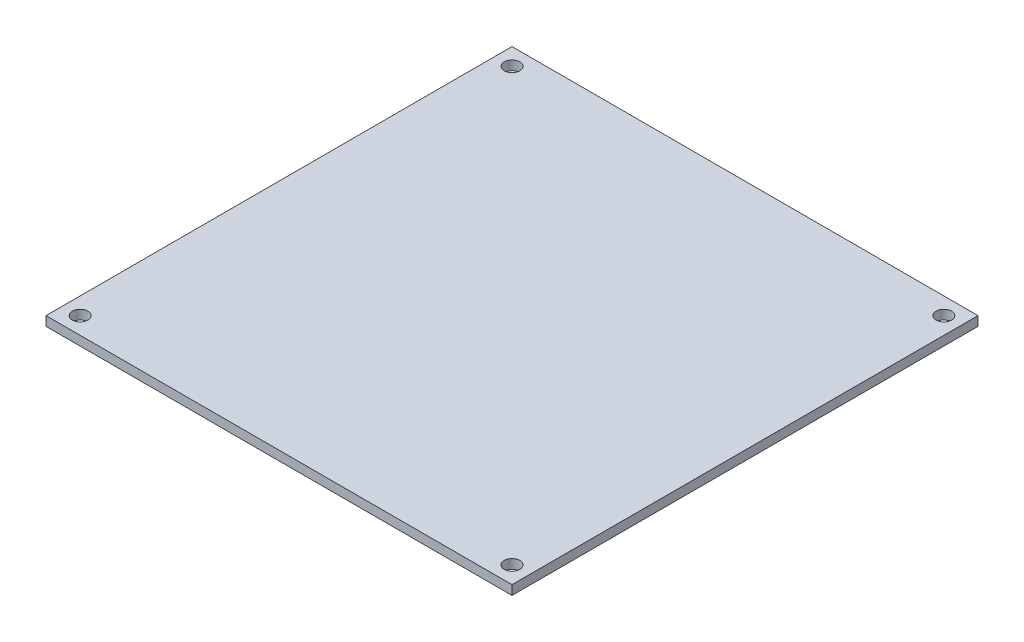
ISO-10303-21;
HEADER;
FILE_DESCRIPTION(('STEP AP214'),'2;1');
FILE_NAME('part.step','',(''),(''),'','','');
FILE_SCHEMA(('AUTOMOTIVE_DESIGN { 1 0 10303 214 1 1 1 1 }'));
ENDSEC;
DATA;
#1=APPLICATION_CONTEXT('core data for automotive mechanical design processes');
#2=APPLICATION_PROTOCOL_DEFINITION('international standard','automotive_design',2000,#1);
#3=PRODUCT_CONTEXT('',#1,'mechanical');
#4=PRODUCT('Part','Part','',(#3));
#5=PRODUCT_RELATED_PRODUCT_CATEGORY('part','',(#4));
#6=PRODUCT_DEFINITION_FORMATION('','',#4);
#7=PRODUCT_DEFINITION_CONTEXT('part definition',#1,'design');
#8=PRODUCT_DEFINITION('design','',#6,#7);
#9=PRODUCT_DEFINITION_SHAPE('','',#8);
#10=(LENGTH_UNIT() NAMED_UNIT(*) SI_UNIT(.MILLI.,.METRE.));
#11=(NAMED_UNIT(*) PLANE_ANGLE_UNIT() SI_UNIT($,.RADIAN.));
#12=(NAMED_UNIT(*) SI_UNIT($,.STERADIAN.) SOLID_ANGLE_UNIT());
#13=UNCERTAINTY_MEASURE_WITH_UNIT(LENGTH_MEASURE(1.E-05),#10,'distance_accuracy_value','');
#14=(GEOMETRIC_REPRESENTATION_CONTEXT(3) GLOBAL_UNCERTAINTY_ASSIGNED_CONTEXT((#13)) GLOBAL_UNIT_ASSIGNED_CONTEXT((#10,
#11,#12)) REPRESENTATION_CONTEXT('',''));
#15=CARTESIAN_POINT('',(0.,0.,0.));
#16=DIRECTION('',(0.,0.,1.));
#17=DIRECTION('',(1.,0.,0.));
#18=AXIS2_PLACEMENT_3D('',#15,#16,#17);
#19=CARTESIAN_POINT('',(150.,6.,-150.));
#20=DIRECTION('',(-1.,0.,0.));
#21=DIRECTION('',(0.,0.,1.));
#22=AXIS2_PLACEMENT_3D('',#19,#20,#21);
#23=PLANE('',#22);
#24=DIRECTION('',(0.,0.,-1.));
#25=VECTOR('',#24,1.);
#26=CARTESIAN_POINT('',(150.,0.,-150.));
#27=LINE('',#26,#25);
#28=CARTESIAN_POINT('',(150.,0.,150.));
#29=VERTEX_POINT('',#28);
#30=CARTESIAN_POINT('',(150.,0.,-150.));
#31=VERTEX_POINT('',#30);
#32=EDGE_CURVE('E96',#29,#31,#27,.T.);
#33=ORIENTED_EDGE('',*,*,#32,.T.);
#34=DIRECTION('',(0.,-1.,0.));
#35=VECTOR('',#34,1.);
#36=CARTESIAN_POINT('',(150.,6.,-150.));
#37=LINE('',#36,#35);
#38=CARTESIAN_POINT('',(150.,6.,-150.));
#39=VERTEX_POINT('',#38);
#40=EDGE_CURVE('E11',#39,#31,#37,.T.);
#41=ORIENTED_EDGE('',*,*,#40,.F.);
#42=DIRECTION('',(0.,0.,-1.));
#43=VECTOR('',#42,1.);
#44=CARTESIAN_POINT('',(150.,6.,-150.));
#45=LINE('',#44,#43);
#46=CARTESIAN_POINT('',(150.,6.,150.));
#47=VERTEX_POINT('',#46);
#48=EDGE_CURVE('E84',#47,#39,#45,.T.);
#49=ORIENTED_EDGE('',*,*,#48,.F.);
#50=DIRECTION('',(0.,-1.,0.));
#51=VECTOR('',#50,1.);
#52=CARTESIAN_POINT('',(150.,6.,150.));
#53=LINE('',#52,#51);
#54=EDGE_CURVE('E92',#47,#29,#53,.T.);
#55=ORIENTED_EDGE('',*,*,#54,.T.);
#56=EDGE_LOOP('',(#33,#41,#49,#55));
#57=FACE_BOUND('',#56,.T.);
#58=ADVANCED_FACE('F33',(#57),#23,.F.);
#59=CARTESIAN_POINT('',(-150.,6.,-150.));
#60=DIRECTION('',(0.,0.,1.));
#61=DIRECTION('',(1.,0.,0.));
#62=AXIS2_PLACEMENT_3D('',#59,#60,#61);
#63=PLANE('',#62);
#64=DIRECTION('',(-1.,0.,0.));
#65=VECTOR('',#64,1.);
#66=CARTESIAN_POINT('',(-150.,0.,-150.));
#67=LINE('',#66,#65);
#68=CARTESIAN_POINT('',(-150.,0.,-150.));
#69=VERTEX_POINT('',#68);
#70=EDGE_CURVE('E88',#31,#69,#67,.T.);
#71=ORIENTED_EDGE('',*,*,#70,.T.);
#72=DIRECTION('',(0.,-1.,0.));
#73=VECTOR('',#72,1.);
#74=CARTESIAN_POINT('',(-150.,6.,-150.));
#75=LINE('',#74,#73);
#76=CARTESIAN_POINT('',(-150.,6.,-150.));
#77=VERTEX_POINT('',#76);
#78=EDGE_CURVE('E41',#77,#69,#75,.T.);
#79=ORIENTED_EDGE('',*,*,#78,.F.);
#80=DIRECTION('',(-1.,0.,0.));
#81=VECTOR('',#80,1.);
#82=CARTESIAN_POINT('',(-150.,6.,-150.));
#83=LINE('',#82,#81);
#84=EDGE_CURVE('E79',#39,#77,#83,.T.);
#85=ORIENTED_EDGE('',*,*,#84,.F.);
#86=ORIENTED_EDGE('',*,*,#40,.T.);
#87=EDGE_LOOP('',(#71,#79,#85,#86));
#88=FACE_BOUND('',#87,.T.);
#89=ADVANCED_FACE('F87',(#88),#63,.F.);
#90=CARTESIAN_POINT('',(-150.,6.,-150.));
#91=DIRECTION('',(1.,0.,0.));
#92=DIRECTION('',(0.,0.,-1.));
#93=AXIS2_PLACEMENT_3D('',#90,#91,#92);
#94=PLANE('',#93);
#95=DIRECTION('',(0.,0.,1.));
#96=VECTOR('',#95,1.);
#97=CARTESIAN_POINT('',(-150.,0.,-150.));
#98=LINE('',#97,#96);
#99=CARTESIAN_POINT('',(-150.,0.,150.));
#100=VERTEX_POINT('',#99);
#101=EDGE_CURVE('E66',#69,#100,#98,.T.);
#102=ORIENTED_EDGE('',*,*,#101,.T.);
#103=DIRECTION('',(0.,-1.,0.));
#104=VECTOR('',#103,1.);
#105=CARTESIAN_POINT('',(-150.,6.,150.));
#106=LINE('',#105,#104);
#107=CARTESIAN_POINT('',(-150.,6.,150.));
#108=VERTEX_POINT('',#107);
#109=EDGE_CURVE('E89',#108,#100,#106,.T.);
#110=ORIENTED_EDGE('',*,*,#109,.F.);
#111=DIRECTION('',(0.,0.,1.));
#112=VECTOR('',#111,1.);
#113=CARTESIAN_POINT('',(-150.,6.,-150.));
#114=LINE('',#113,#112);
#115=EDGE_CURVE('E82',#77,#108,#114,.T.);
#116=ORIENTED_EDGE('',*,*,#115,.F.);
#117=ORIENTED_EDGE('',*,*,#78,.T.);
#118=EDGE_LOOP('',(#102,#110,#116,#117));
#119=FACE_BOUND('',#118,.T.);
#120=ADVANCED_FACE('F90',(#119),#94,.F.);
#121=CARTESIAN_POINT('',(-150.,6.,150.));
#122=DIRECTION('',(0.,0.,-1.));
#123=DIRECTION('',(-1.,0.,0.));
#124=AXIS2_PLACEMENT_3D('',#121,#122,#123);
#125=PLANE('',#124);
#126=DIRECTION('',(1.,0.,0.));
#127=VECTOR('',#126,1.);
#128=CARTESIAN_POINT('',(-150.,0.,150.));
#129=LINE('',#128,#127);
#130=EDGE_CURVE('E72',#100,#29,#129,.T.);
#131=ORIENTED_EDGE('',*,*,#130,.T.);
#132=ORIENTED_EDGE('',*,*,#54,.F.);
#133=DIRECTION('',(1.,0.,0.));
#134=VECTOR('',#133,1.);
#135=CARTESIAN_POINT('',(-150.,6.,150.));
#136=LINE('',#135,#134);
#137=EDGE_CURVE('E49',#108,#47,#136,.T.);
#138=ORIENTED_EDGE('',*,*,#137,.F.);
#139=ORIENTED_EDGE('',*,*,#109,.T.);
#140=EDGE_LOOP('',(#131,#132,#138,#139));
#141=FACE_BOUND('',#140,.T.);
#142=ADVANCED_FACE('F104',(#141),#125,.F.);
#143=CARTESIAN_POINT('',(0.,6.,0.));
#144=DIRECTION('',(0.,1.,0.));
#145=DIRECTION('',(0.,0.,1.));
#146=AXIS2_PLACEMENT_3D('',#143,#144,#145);
#147=PLANE('',#146);
#148=CARTESIAN_POINT('',(139.,6.,-139.));
#149=DIRECTION('',(0.,1.,0.));
#150=DIRECTION('',(0.,0.,1.));
#151=AXIS2_PLACEMENT_3D('',#148,#149,#150);
#152=CIRCLE('',#151,5.00000000000002);
#153=CARTESIAN_POINT('',(139.,6.,-134.));
#154=VERTEX_POINT('',#153);
#155=EDGE_CURVE('E128',#154,#154,#152,.T.);
#156=ORIENTED_EDGE('',*,*,#155,.F.);
#157=EDGE_LOOP('',(#156));
#158=FACE_BOUND('',#157,.T.);
#159=CARTESIAN_POINT('',(139.,6.,139.));
#160=DIRECTION('',(0.,1.,0.));
#161=DIRECTION('',(0.,0.,1.));
#162=AXIS2_PLACEMENT_3D('',#159,#160,#161);
#163=CIRCLE('',#162,5.00000000000002);
#164=CARTESIAN_POINT('',(139.,6.,144.));
#165=VERTEX_POINT('',#164);
#166=EDGE_CURVE('E122',#165,#165,#163,.T.);
#167=ORIENTED_EDGE('',*,*,#166,.F.);
#168=EDGE_LOOP('',(#167));
#169=FACE_BOUND('',#168,.T.);
#170=CARTESIAN_POINT('',(-139.,6.,139.));
#171=DIRECTION('',(0.,1.,0.));
#172=DIRECTION('',(0.,0.,1.));
#173=AXIS2_PLACEMENT_3D('',#170,#171,#172);
#174=CIRCLE('',#173,5.00000000000002);
#175=CARTESIAN_POINT('',(-139.,6.,144.));
#176=VERTEX_POINT('',#175);
#177=EDGE_CURVE('E116',#176,#176,#174,.T.);
#178=ORIENTED_EDGE('',*,*,#177,.F.);
#179=EDGE_LOOP('',(#178));
#180=FACE_BOUND('',#179,.T.);
#181=CARTESIAN_POINT('',(-139.,6.,-139.));
#182=DIRECTION('',(0.,1.,0.));
#183=DIRECTION('',(0.,0.,1.));
#184=AXIS2_PLACEMENT_3D('',#181,#182,#183);
#185=CIRCLE('',#184,5.00000000000002);
#186=CARTESIAN_POINT('',(-139.,6.,-134.));
#187=VERTEX_POINT('',#186);
#188=EDGE_CURVE('E110',#187,#187,#185,.T.);
#189=ORIENTED_EDGE('',*,*,#188,.F.);
#190=EDGE_LOOP('',(#189));
#191=FACE_BOUND('',#190,.T.);
#192=ORIENTED_EDGE('',*,*,#48,.T.);
#193=ORIENTED_EDGE('',*,*,#84,.T.);
#194=ORIENTED_EDGE('',*,*,#115,.T.);
#195=ORIENTED_EDGE('',*,*,#137,.T.);
#196=EDGE_LOOP('',(#192,#193,#194,#195));
#197=FACE_BOUND('',#196,.T.);
#198=ADVANCED_FACE('F80',(#158,#169,#180,#191,#197),#147,.T.);
#199=CARTESIAN_POINT('',(0.,0.,0.));
#200=DIRECTION('',(0.,1.,0.));
#201=DIRECTION('',(0.,0.,1.));
#202=AXIS2_PLACEMENT_3D('',#199,#200,#201);
#203=PLANE('',#202);
#204=CARTESIAN_POINT('',(139.,0.,-139.));
#205=DIRECTION('',(0.,1.,0.));
#206=DIRECTION('',(0.,0.,1.));
#207=AXIS2_PLACEMENT_3D('',#204,#205,#206);
#208=CIRCLE('',#207,5.00000000000002);
#209=CARTESIAN_POINT('',(139.,0.,-134.));
#210=VERTEX_POINT('',#209);
#211=EDGE_CURVE('E113',#210,#210,#208,.T.);
#212=ORIENTED_EDGE('',*,*,#211,.T.);
#213=EDGE_LOOP('',(#212));
#214=FACE_BOUND('',#213,.T.);
#215=CARTESIAN_POINT('',(139.,0.,139.));
#216=DIRECTION('',(0.,1.,0.));
#217=DIRECTION('',(0.,0.,1.));
#218=AXIS2_PLACEMENT_3D('',#215,#216,#217);
#219=CIRCLE('',#218,5.00000000000002);
#220=CARTESIAN_POINT('',(139.,0.,144.));
#221=VERTEX_POINT('',#220);
#222=EDGE_CURVE('E125',#221,#221,#219,.T.);
#223=ORIENTED_EDGE('',*,*,#222,.T.);
#224=EDGE_LOOP('',(#223));
#225=FACE_BOUND('',#224,.T.);
#226=CARTESIAN_POINT('',(-139.,0.,139.));
#227=DIRECTION('',(0.,1.,0.));
#228=DIRECTION('',(0.,0.,1.));
#229=AXIS2_PLACEMENT_3D('',#226,#227,#228);
#230=CIRCLE('',#229,5.00000000000002);
#231=CARTESIAN_POINT('',(-139.,0.,144.));
#232=VERTEX_POINT('',#231);
#233=EDGE_CURVE('E119',#232,#232,#230,.T.);
#234=ORIENTED_EDGE('',*,*,#233,.T.);
#235=EDGE_LOOP('',(#234));
#236=FACE_BOUND('',#235,.T.);
#237=CARTESIAN_POINT('',(-139.,0.,-139.));
#238=DIRECTION('',(0.,1.,0.));
#239=DIRECTION('',(0.,0.,1.));
#240=AXIS2_PLACEMENT_3D('',#237,#238,#239);
#241=CIRCLE('',#240,5.00000000000002);
#242=CARTESIAN_POINT('',(-139.,0.,-134.));
#243=VERTEX_POINT('',#242);
#244=EDGE_CURVE('E99',#243,#243,#241,.T.);
#245=ORIENTED_EDGE('',*,*,#244,.T.);
#246=EDGE_LOOP('',(#245));
#247=FACE_BOUND('',#246,.T.);
#248=ORIENTED_EDGE('',*,*,#32,.F.);
#249=ORIENTED_EDGE('',*,*,#130,.F.);
#250=ORIENTED_EDGE('',*,*,#101,.F.);
#251=ORIENTED_EDGE('',*,*,#70,.F.);
#252=EDGE_LOOP('',(#248,#249,#250,#251));
#253=FACE_BOUND('',#252,.T.);
#254=ADVANCED_FACE('F107',(#214,#225,#236,#247,#253),#203,.F.);
#255=CARTESIAN_POINT('',(-139.,0.,-139.));
#256=DIRECTION('',(0.,1.,0.));
#257=DIRECTION('',(0.,0.,1.));
#258=AXIS2_PLACEMENT_3D('',#255,#256,#257);
#259=CYLINDRICAL_SURFACE('',#258,5.00000000000002);
#260=ORIENTED_EDGE('',*,*,#244,.F.);
#261=EDGE_LOOP('',(#260));
#262=FACE_BOUND('',#261,.T.);
#263=ORIENTED_EDGE('',*,*,#188,.T.);
#264=EDGE_LOOP('',(#263));
#265=FACE_BOUND('',#264,.T.);
#266=ADVANCED_FACE('F152',(#262,#265),#259,.F.);
#267=CARTESIAN_POINT('',(-139.,0.,139.));
#268=DIRECTION('',(0.,1.,0.));
#269=DIRECTION('',(0.,0.,1.));
#270=AXIS2_PLACEMENT_3D('',#267,#268,#269);
#271=CYLINDRICAL_SURFACE('',#270,5.00000000000002);
#272=ORIENTED_EDGE('',*,*,#233,.F.);
#273=EDGE_LOOP('',(#272));
#274=FACE_BOUND('',#273,.T.);
#275=ORIENTED_EDGE('',*,*,#177,.T.);
#276=EDGE_LOOP('',(#275));
#277=FACE_BOUND('',#276,.T.);
#278=ADVANCED_FACE('F154',(#274,#277),#271,.F.);
#279=CARTESIAN_POINT('',(139.,0.,139.));
#280=DIRECTION('',(0.,1.,0.));
#281=DIRECTION('',(0.,0.,1.));
#282=AXIS2_PLACEMENT_3D('',#279,#280,#281);
#283=CYLINDRICAL_SURFACE('',#282,5.00000000000002);
#284=ORIENTED_EDGE('',*,*,#222,.F.);
#285=EDGE_LOOP('',(#284));
#286=FACE_BOUND('',#285,.T.);
#287=ORIENTED_EDGE('',*,*,#166,.T.);
#288=EDGE_LOOP('',(#287));
#289=FACE_BOUND('',#288,.T.);
#290=ADVANCED_FACE('F139',(#286,#289),#283,.F.);
#291=CARTESIAN_POINT('',(139.,0.,-139.));
#292=DIRECTION('',(0.,1.,0.));
#293=DIRECTION('',(0.,0.,1.));
#294=AXIS2_PLACEMENT_3D('',#291,#292,#293);
#295=CYLINDRICAL_SURFACE('',#294,5.00000000000002);
#296=ORIENTED_EDGE('',*,*,#211,.F.);
#297=EDGE_LOOP('',(#296));
#298=FACE_BOUND('',#297,.T.);
#299=ORIENTED_EDGE('',*,*,#155,.T.);
#300=EDGE_LOOP('',(#299));
#301=FACE_BOUND('',#300,.T.);
#302=ADVANCED_FACE('F136',(#298,#301),#295,.F.);
#303=CLOSED_SHELL('',(#58,#89,#120,#142,#198,#254,#266,#278,#290,#302));
#304=MANIFOLD_SOLID_BREP('B2',#303);
#305=ADVANCED_BREP_SHAPE_REPRESENTATION('',(#18,#304),#14);
#306=SHAPE_DEFINITION_REPRESENTATION(#9,#305);
ENDSEC;
END-ISO-10303-21;
